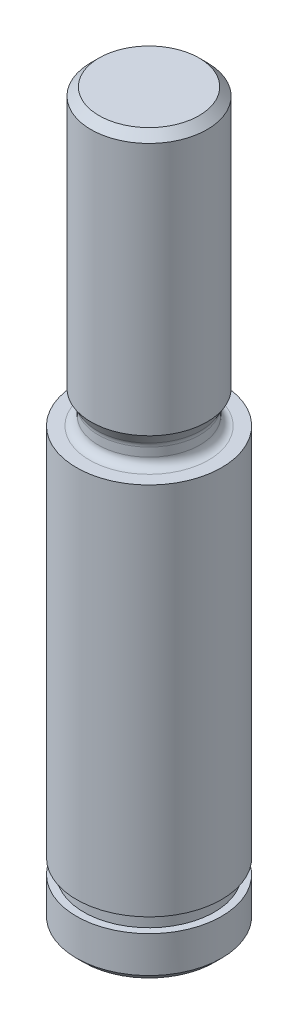
ISO-10303-21;
HEADER;
FILE_DESCRIPTION(('STEP AP214'),'2;1');
FILE_NAME('part.step','',(''),(''),'','','');
FILE_SCHEMA(('AUTOMOTIVE_DESIGN { 1 0 10303 214 1 1 1 1 }'));
ENDSEC;
DATA;
#1=APPLICATION_CONTEXT('core data for automotive mechanical design processes');
#2=APPLICATION_PROTOCOL_DEFINITION('international standard','automotive_design',2000,#1);
#3=PRODUCT_CONTEXT('',#1,'mechanical');
#4=PRODUCT('Part','Part','',(#3));
#5=PRODUCT_RELATED_PRODUCT_CATEGORY('part','',(#4));
#6=PRODUCT_DEFINITION_FORMATION('','',#4);
#7=PRODUCT_DEFINITION_CONTEXT('part definition',#1,'design');
#8=PRODUCT_DEFINITION('design','',#6,#7);
#9=PRODUCT_DEFINITION_SHAPE('','',#8);
#10=(LENGTH_UNIT() NAMED_UNIT(*) SI_UNIT(.MILLI.,.METRE.));
#11=(NAMED_UNIT(*) PLANE_ANGLE_UNIT() SI_UNIT($,.RADIAN.));
#12=(NAMED_UNIT(*) SI_UNIT($,.STERADIAN.) SOLID_ANGLE_UNIT());
#13=UNCERTAINTY_MEASURE_WITH_UNIT(LENGTH_MEASURE(1.E-05),#10,'distance_accuracy_value','');
#14=(GEOMETRIC_REPRESENTATION_CONTEXT(3) GLOBAL_UNCERTAINTY_ASSIGNED_CONTEXT((#13)) GLOBAL_UNIT_ASSIGNED_CONTEXT((#10,
#11,#12)) REPRESENTATION_CONTEXT('',''));
#15=CARTESIAN_POINT('',(0.,0.,0.));
#16=DIRECTION('',(0.,0.,1.));
#17=DIRECTION('',(1.,0.,0.));
#18=AXIS2_PLACEMENT_3D('',#15,#16,#17);
#19=CARTESIAN_POINT('',(0.,50.,0.));
#20=DIRECTION('',(0.,-1.,0.));
#21=DIRECTION('',(0.,0.,-1.));
#22=AXIS2_PLACEMENT_3D('',#19,#20,#21);
#23=CYLINDRICAL_SURFACE('',#22,5.);
#24=CARTESIAN_POINT('',(0.,29.7732050807568,0.));
#25=DIRECTION('',(0.,-1.,0.));
#26=DIRECTION('',(0.,0.,-1.));
#27=AXIS2_PLACEMENT_3D('',#24,#25,#26);
#28=CIRCLE('',#27,5.);
#29=CARTESIAN_POINT('',(0.,29.7732050807568,-5.));
#30=VERTEX_POINT('',#29);
#31=EDGE_CURVE('E82',#30,#30,#28,.T.);
#32=ORIENTED_EDGE('',*,*,#31,.T.);
#33=EDGE_LOOP('',(#32));
#34=FACE_BOUND('',#33,.T.);
#35=CARTESIAN_POINT('',(0.,4.,0.));
#36=DIRECTION('',(0.,-1.,0.));
#37=DIRECTION('',(0.,0.,-1.));
#38=AXIS2_PLACEMENT_3D('',#35,#36,#37);
#39=CIRCLE('',#38,5.);
#40=CARTESIAN_POINT('',(0.,4.,-5.));
#41=VERTEX_POINT('',#40);
#42=EDGE_CURVE('E94',#41,#41,#39,.T.);
#43=ORIENTED_EDGE('',*,*,#42,.F.);
#44=EDGE_LOOP('',(#43));
#45=FACE_BOUND('',#44,.T.);
#46=ADVANCED_FACE('F42',(#34,#45),#23,.T.);
#47=CARTESIAN_POINT('',(0.,50.,0.));
#48=DIRECTION('',(0.,-1.,0.));
#49=DIRECTION('',(0.,0.,-1.));
#50=AXIS2_PLACEMENT_3D('',#47,#48,#49);
#51=CYLINDRICAL_SURFACE('',#50,4.);
#52=CARTESIAN_POINT('',(0.,32.,0.));
#53=DIRECTION('',(0.,-1.,0.));
#54=DIRECTION('',(0.,0.,-1.));
#55=AXIS2_PLACEMENT_3D('',#52,#53,#54);
#56=CIRCLE('',#55,4.);
#57=CARTESIAN_POINT('',(0.,32.,-4.));
#58=VERTEX_POINT('',#57);
#59=EDGE_CURVE('E58',#58,#58,#56,.T.);
#60=ORIENTED_EDGE('',*,*,#59,.F.);
#61=EDGE_LOOP('',(#60));
#62=FACE_BOUND('',#61,.T.);
#63=CARTESIAN_POINT('',(0.,49.4455,0.));
#64=DIRECTION('',(0.,-1.,0.));
#65=DIRECTION('',(0.,0.,-1.));
#66=AXIS2_PLACEMENT_3D('',#63,#64,#65);
#67=CIRCLE('',#66,4.);
#68=CARTESIAN_POINT('',(0.,49.4455,-4.));
#69=VERTEX_POINT('',#68);
#70=EDGE_CURVE('E90',#69,#69,#67,.T.);
#71=ORIENTED_EDGE('',*,*,#70,.T.);
#72=EDGE_LOOP('',(#71));
#73=FACE_BOUND('',#72,.T.);
#74=ADVANCED_FACE('F123',(#62,#73),#51,.T.);
#75=CARTESIAN_POINT('',(0.,32.,0.));
#76=DIRECTION('',(0.,1.,0.));
#77=DIRECTION('',(0.,0.,1.));
#78=AXIS2_PLACEMENT_3D('',#75,#76,#77);
#79=CONICAL_SURFACE('',#78,4.,0.523598775598274);
#80=CARTESIAN_POINT('',(0.,31.2732050807568,0.));
#81=DIRECTION('',(0.,-1.,0.));
#82=DIRECTION('',(0.,0.,-1.));
#83=AXIS2_PLACEMENT_3D('',#80,#81,#82);
#84=CIRCLE('',#83,3.58038475772933);
#85=CARTESIAN_POINT('',(0.,31.2732050807568,-3.58038475772933));
#86=VERTEX_POINT('',#85);
#87=EDGE_CURVE('E65',#86,#86,#84,.T.);
#88=ORIENTED_EDGE('',*,*,#87,.F.);
#89=EDGE_LOOP('',(#88));
#90=FACE_BOUND('',#89,.T.);
#91=ORIENTED_EDGE('',*,*,#59,.T.);
#92=EDGE_LOOP('',(#91));
#93=FACE_BOUND('',#92,.T.);
#94=ADVANCED_FACE('F129',(#90,#93),#79,.T.);
#95=CARTESIAN_POINT('',(0.,30.9732050807568,0.));
#96=DIRECTION('',(0.,-1.,0.));
#97=DIRECTION('',(0.,0.,-1.));
#98=AXIS2_PLACEMENT_3D('',#95,#96,#97);
#99=TOROIDAL_SURFACE('',#98,4.1,0.600000000000001);
#100=CARTESIAN_POINT('',(0.,30.9732050807568,0.));
#101=DIRECTION('',(0.,-1.,0.));
#102=DIRECTION('',(0.,0.,-1.));
#103=AXIS2_PLACEMENT_3D('',#100,#101,#102);
#104=CIRCLE('',#103,3.5);
#105=CARTESIAN_POINT('',(0.,30.9732050807568,-3.5));
#106=VERTEX_POINT('',#105);
#107=EDGE_CURVE('E71',#106,#106,#104,.T.);
#108=ORIENTED_EDGE('',*,*,#107,.F.);
#109=EDGE_LOOP('',(#108));
#110=FACE_BOUND('',#109,.T.);
#111=ORIENTED_EDGE('',*,*,#87,.T.);
#112=EDGE_LOOP('',(#111));
#113=FACE_BOUND('',#112,.T.);
#114=ADVANCED_FACE('F165',(#110,#113),#99,.F.);
#115=CARTESIAN_POINT('',(0.,50.,0.));
#116=DIRECTION('',(0.,-1.,0.));
#117=DIRECTION('',(0.,0.,-1.));
#118=AXIS2_PLACEMENT_3D('',#115,#116,#117);
#119=CYLINDRICAL_SURFACE('',#118,3.5);
#120=CARTESIAN_POINT('',(0.,30.3732050807568,0.));
#121=DIRECTION('',(0.,-1.,0.));
#122=DIRECTION('',(0.,0.,-1.));
#123=AXIS2_PLACEMENT_3D('',#120,#121,#122);
#124=CIRCLE('',#123,3.5);
#125=CARTESIAN_POINT('',(0.,30.3732050807568,-3.5));
#126=VERTEX_POINT('',#125);
#127=EDGE_CURVE('E75',#126,#126,#124,.T.);
#128=ORIENTED_EDGE('',*,*,#127,.F.);
#129=EDGE_LOOP('',(#128));
#130=FACE_BOUND('',#129,.T.);
#131=ORIENTED_EDGE('',*,*,#107,.T.);
#132=EDGE_LOOP('',(#131));
#133=FACE_BOUND('',#132,.T.);
#134=ADVANCED_FACE('F161',(#130,#133),#119,.T.);
#135=CARTESIAN_POINT('',(0.,30.3732050807568,0.));
#136=DIRECTION('',(0.,-1.,0.));
#137=DIRECTION('',(0.,0.,-1.));
#138=AXIS2_PLACEMENT_3D('',#135,#136,#137);
#139=TOROIDAL_SURFACE('',#138,4.1,0.6);
#140=CARTESIAN_POINT('',(0.,29.7732050807568,0.));
#141=DIRECTION('',(0.,-1.,0.));
#142=DIRECTION('',(0.,0.,-1.));
#143=AXIS2_PLACEMENT_3D('',#140,#141,#142);
#144=CIRCLE('',#143,4.1);
#145=CARTESIAN_POINT('',(0.,29.7732050807568,-4.1));
#146=VERTEX_POINT('',#145);
#147=EDGE_CURVE('E79',#146,#146,#144,.T.);
#148=ORIENTED_EDGE('',*,*,#147,.F.);
#149=EDGE_LOOP('',(#148));
#150=FACE_BOUND('',#149,.T.);
#151=ORIENTED_EDGE('',*,*,#127,.T.);
#152=EDGE_LOOP('',(#151));
#153=FACE_BOUND('',#152,.T.);
#154=ADVANCED_FACE('F157',(#150,#153),#139,.F.);
#155=CARTESIAN_POINT('',(4.1,29.7732050807568,0.));
#156=DIRECTION('',(0.,-1.,0.));
#157=DIRECTION('',(0.,0.,-1.));
#158=AXIS2_PLACEMENT_3D('',#155,#156,#157);
#159=PLANE('',#158);
#160=ORIENTED_EDGE('',*,*,#31,.F.);
#161=EDGE_LOOP('',(#160));
#162=FACE_BOUND('',#161,.T.);
#163=ORIENTED_EDGE('',*,*,#147,.T.);
#164=EDGE_LOOP('',(#163));
#165=FACE_BOUND('',#164,.T.);
#166=ADVANCED_FACE('F153',(#162,#165),#159,.F.);
#167=CARTESIAN_POINT('',(0.,50.,0.));
#168=DIRECTION('',(0.,-1.,0.));
#169=DIRECTION('',(0.,0.,-1.));
#170=AXIS2_PLACEMENT_3D('',#167,#168,#169);
#171=CONICAL_SURFACE('',#170,3.4455,0.785398163397455);
#172=ORIENTED_EDGE('',*,*,#70,.F.);
#173=EDGE_LOOP('',(#172));
#174=FACE_BOUND('',#173,.T.);
#175=CARTESIAN_POINT('',(0.,50.,0.));
#176=DIRECTION('',(0.,-1.,0.));
#177=DIRECTION('',(0.,0.,-1.));
#178=AXIS2_PLACEMENT_3D('',#175,#176,#177);
#179=CIRCLE('',#178,3.4455);
#180=CARTESIAN_POINT('',(0.,50.,-3.4455));
#181=VERTEX_POINT('',#180);
#182=EDGE_CURVE('E86',#181,#181,#179,.T.);
#183=ORIENTED_EDGE('',*,*,#182,.T.);
#184=EDGE_LOOP('',(#183));
#185=FACE_BOUND('',#184,.T.);
#186=ADVANCED_FACE('F150',(#174,#185),#171,.T.);
#187=CARTESIAN_POINT('',(0.,50.,0.));
#188=DIRECTION('',(0.,1.,0.));
#189=DIRECTION('',(0.,0.,1.));
#190=AXIS2_PLACEMENT_3D('',#187,#188,#189);
#191=PLANE('',#190);
#192=ORIENTED_EDGE('',*,*,#182,.F.);
#193=EDGE_LOOP('',(#192));
#194=FACE_BOUND('',#193,.T.);
#195=ADVANCED_FACE('F118',(#194),#191,.T.);
#196=CARTESIAN_POINT('',(0.,4.,0.));
#197=DIRECTION('',(0.,-1.,0.));
#198=DIRECTION('',(0.,0.,-1.));
#199=AXIS2_PLACEMENT_3D('',#196,#197,#198);
#200=PLANE('',#199);
#201=CARTESIAN_POINT('',(0.,4.,0.));
#202=DIRECTION('',(0.,-1.,0.));
#203=DIRECTION('',(0.,0.,-1.));
#204=AXIS2_PLACEMENT_3D('',#201,#202,#203);
#205=CIRCLE('',#204,4.5);
#206=CARTESIAN_POINT('',(0.,4.,-4.5));
#207=VERTEX_POINT('',#206);
#208=EDGE_CURVE('E99',#207,#207,#205,.T.);
#209=ORIENTED_EDGE('',*,*,#208,.F.);
#210=EDGE_LOOP('',(#209));
#211=FACE_BOUND('',#210,.T.);
#212=ORIENTED_EDGE('',*,*,#42,.T.);
#213=EDGE_LOOP('',(#212));
#214=FACE_BOUND('',#213,.T.);
#215=ADVANCED_FACE('F114',(#211,#214),#200,.T.);
#216=CARTESIAN_POINT('',(0.,3.,0.));
#217=DIRECTION('',(0.,-1.,0.));
#218=DIRECTION('',(0.,0.,-1.));
#219=AXIS2_PLACEMENT_3D('',#216,#217,#218);
#220=PLANE('',#219);
#221=CARTESIAN_POINT('',(0.,3.,0.));
#222=DIRECTION('',(0.,-1.,0.));
#223=DIRECTION('',(0.,0.,-1.));
#224=AXIS2_PLACEMENT_3D('',#221,#222,#223);
#225=CIRCLE('',#224,4.5);
#226=CARTESIAN_POINT('',(0.,3.,-4.5));
#227=VERTEX_POINT('',#226);
#228=EDGE_CURVE('E103',#227,#227,#225,.T.);
#229=ORIENTED_EDGE('',*,*,#228,.T.);
#230=EDGE_LOOP('',(#229));
#231=FACE_BOUND('',#230,.T.);
#232=CARTESIAN_POINT('',(0.,3.,0.));
#233=DIRECTION('',(0.,-1.,0.));
#234=DIRECTION('',(0.,0.,-1.));
#235=AXIS2_PLACEMENT_3D('',#232,#233,#234);
#236=CIRCLE('',#235,5.);
#237=CARTESIAN_POINT('',(0.,3.,-5.));
#238=VERTEX_POINT('',#237);
#239=EDGE_CURVE('E95',#238,#238,#236,.T.);
#240=ORIENTED_EDGE('',*,*,#239,.F.);
#241=EDGE_LOOP('',(#240));
#242=FACE_BOUND('',#241,.T.);
#243=ADVANCED_FACE('F117',(#231,#242),#220,.F.);
#244=CARTESIAN_POINT('',(0.,4.,0.));
#245=DIRECTION('',(0.,-1.,0.));
#246=DIRECTION('',(0.,0.,-1.));
#247=AXIS2_PLACEMENT_3D('',#244,#245,#246);
#248=CYLINDRICAL_SURFACE('',#247,4.5);
#249=ORIENTED_EDGE('',*,*,#208,.T.);
#250=EDGE_LOOP('',(#249));
#251=FACE_BOUND('',#250,.T.);
#252=ORIENTED_EDGE('',*,*,#228,.F.);
#253=EDGE_LOOP('',(#252));
#254=FACE_BOUND('',#253,.T.);
#255=ADVANCED_FACE('F111',(#251,#254),#248,.T.);
#256=CARTESIAN_POINT('',(0.,0.,0.));
#257=DIRECTION('',(0.,1.,0.));
#258=DIRECTION('',(0.,0.,1.));
#259=AXIS2_PLACEMENT_3D('',#256,#257,#258);
#260=PLANE('',#259);
#261=CARTESIAN_POINT('',(0.,0.,0.));
#262=DIRECTION('',(0.,1.,0.));
#263=DIRECTION('',(0.,0.,1.));
#264=AXIS2_PLACEMENT_3D('',#261,#262,#263);
#265=CIRCLE('',#264,4.5);
#266=CARTESIAN_POINT('',(0.,0.,4.5));
#267=VERTEX_POINT('',#266);
#268=EDGE_CURVE('E10',#267,#267,#265,.F.);
#269=ORIENTED_EDGE('',*,*,#268,.T.);
#270=EDGE_LOOP('',(#269));
#271=FACE_BOUND('',#270,.T.);
#272=ADVANCED_FACE('F138',(#271),#260,.F.);
#273=CARTESIAN_POINT('',(0.,0.5,0.));
#274=DIRECTION('',(0.,1.,0.));
#275=DIRECTION('',(0.,0.,1.));
#276=AXIS2_PLACEMENT_3D('',#273,#274,#275);
#277=CONICAL_SURFACE('',#276,5.,0.78539816339745);
#278=ORIENTED_EDGE('',*,*,#268,.F.);
#279=EDGE_LOOP('',(#278));
#280=FACE_BOUND('',#279,.T.);
#281=CARTESIAN_POINT('',(0.,0.5,0.));
#282=DIRECTION('',(0.,1.,0.));
#283=DIRECTION('',(0.,0.,1.));
#284=AXIS2_PLACEMENT_3D('',#281,#282,#283);
#285=CIRCLE('',#284,5.);
#286=CARTESIAN_POINT('',(0.,0.5,5.));
#287=VERTEX_POINT('',#286);
#288=EDGE_CURVE('E51',#287,#287,#285,.T.);
#289=ORIENTED_EDGE('',*,*,#288,.F.);
#290=EDGE_LOOP('',(#289));
#291=FACE_BOUND('',#290,.T.);
#292=ADVANCED_FACE('F45',(#280,#291),#277,.T.);
#293=ORIENTED_EDGE('',*,*,#239,.T.);
#294=EDGE_LOOP('',(#293));
#295=FACE_BOUND('',#294,.T.);
#296=ORIENTED_EDGE('',*,*,#288,.T.);
#297=EDGE_LOOP('',(#296));
#298=FACE_BOUND('',#297,.T.);
#299=ADVANCED_FACE('F125',(#295,#298),#23,.T.);
#300=CLOSED_SHELL('',(#46,#74,#94,#114,#134,#154,#166,#186,#195,#215,#243,#255,#272,#292,#299));
#301=MANIFOLD_SOLID_BREP('B2',#300);
#302=ADVANCED_BREP_SHAPE_REPRESENTATION('',(#18,#301),#14);
#303=SHAPE_DEFINITION_REPRESENTATION(#9,#302);
ENDSEC;
END-ISO-10303-21;
